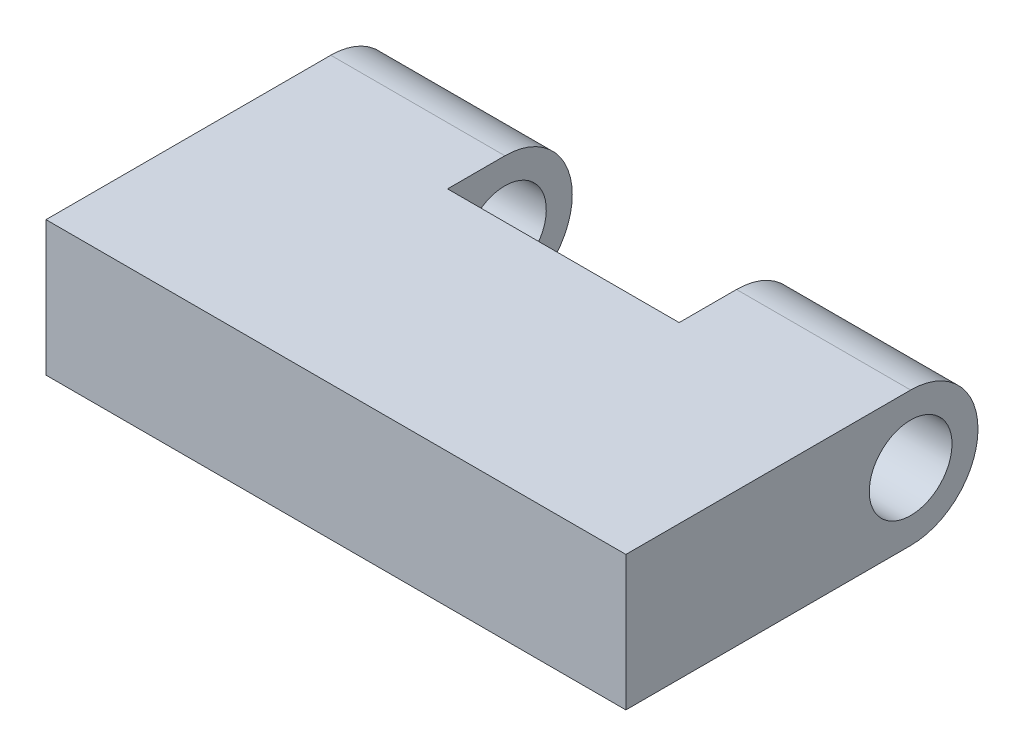
ISO-10303-21;
HEADER;
FILE_DESCRIPTION(('STEP AP214'),'2;1');
FILE_NAME('part.step','',(''),(''),'','','');
FILE_SCHEMA(('AUTOMOTIVE_DESIGN { 1 0 10303 214 1 1 1 1 }'));
ENDSEC;
DATA;
#1=APPLICATION_CONTEXT('core data for automotive mechanical design processes');
#2=APPLICATION_PROTOCOL_DEFINITION('international standard','automotive_design',2000,#1);
#3=PRODUCT_CONTEXT('',#1,'mechanical');
#4=PRODUCT('Part','Part','',(#3));
#5=PRODUCT_RELATED_PRODUCT_CATEGORY('part','',(#4));
#6=PRODUCT_DEFINITION_FORMATION('','',#4);
#7=PRODUCT_DEFINITION_CONTEXT('part definition',#1,'design');
#8=PRODUCT_DEFINITION('design','',#6,#7);
#9=PRODUCT_DEFINITION_SHAPE('','',#8);
#10=(LENGTH_UNIT() NAMED_UNIT(*) SI_UNIT(.MILLI.,.METRE.));
#11=(NAMED_UNIT(*) PLANE_ANGLE_UNIT() SI_UNIT($,.RADIAN.));
#12=(NAMED_UNIT(*) SI_UNIT($,.STERADIAN.) SOLID_ANGLE_UNIT());
#13=UNCERTAINTY_MEASURE_WITH_UNIT(LENGTH_MEASURE(1.E-05),#10,'distance_accuracy_value','');
#14=(GEOMETRIC_REPRESENTATION_CONTEXT(3) GLOBAL_UNCERTAINTY_ASSIGNED_CONTEXT((#13)) GLOBAL_UNIT_ASSIGNED_CONTEXT((#10,
#11,#12)) REPRESENTATION_CONTEXT('',''));
#15=CARTESIAN_POINT('',(0.,0.,0.));
#16=DIRECTION('',(0.,0.,1.));
#17=DIRECTION('',(1.,0.,0.));
#18=AXIS2_PLACEMENT_3D('',#15,#16,#17);
#19=CARTESIAN_POINT('',(6.05974292566278,17.5769670723901,-2.39859921827593));
#20=DIRECTION('',(1.,0.,0.));
#21=DIRECTION('',(0.,1.,0.));
#22=AXIS2_PLACEMENT_3D('',#19,#20,#21);
#23=PLANE('',#22);
#24=CARTESIAN_POINT('',(6.05974292566278,17.5769670723901,-2.39859921827593));
#25=DIRECTION('',(1.,0.,0.));
#26=DIRECTION('',(0.,1.,0.));
#27=AXIS2_PLACEMENT_3D('',#24,#25,#26);
#28=CIRCLE('',#27,2.37553);
#29=CARTESIAN_POINT('',(6.05974292566278,19.9524970723901,-2.39859921827593));
#30=VERTEX_POINT('',#29);
#31=EDGE_CURVE('E151',#30,#30,#28,.T.);
#32=ORIENTED_EDGE('',*,*,#31,.T.);
#33=EDGE_LOOP('',(#32));
#34=FACE_BOUND('',#33,.T.);
#35=DIRECTION('',(0.,-1.,0.));
#36=VECTOR('',#35,1.);
#37=CARTESIAN_POINT('',(6.05974292566278,13.7097679309726,0.894908454199594));
#38=LINE('',#37,#36);
#39=CARTESIAN_POINT('',(6.05974292566278,21.4441662138076,0.894908454199594));
#40=VERTEX_POINT('',#39);
#41=CARTESIAN_POINT('',(6.05974292566278,13.7097679309726,0.894908454199594));
#42=VERTEX_POINT('',#41);
#43=EDGE_CURVE('E50',#40,#42,#38,.T.);
#44=ORIENTED_EDGE('',*,*,#43,.F.);
#45=DIRECTION('',(0.,0.,1.));
#46=VECTOR('',#45,1.);
#47=CARTESIAN_POINT('',(6.05974292566278,21.4441662138076,3.36865125823493));
#48=LINE('',#47,#46);
#49=CARTESIAN_POINT('',(6.05974292566278,21.4441662138076,-2.39859921827593));
#50=VERTEX_POINT('',#49);
#51=EDGE_CURVE('E71',#50,#40,#48,.T.);
#52=ORIENTED_EDGE('',*,*,#51,.F.);
#53=CARTESIAN_POINT('',(6.05974292566278,17.5769670723901,-2.39859921827593));
#54=DIRECTION('',(1.,0.,0.));
#55=DIRECTION('',(0.,1.,0.));
#56=AXIS2_PLACEMENT_3D('',#53,#54,#55);
#57=CIRCLE('',#56,3.86719914141752);
#58=CARTESIAN_POINT('',(6.05974292566278,13.7097679309726,-2.39859921827593));
#59=VERTEX_POINT('',#58);
#60=EDGE_CURVE('E169',#59,#50,#57,.T.);
#61=ORIENTED_EDGE('',*,*,#60,.F.);
#62=DIRECTION('',(0.,0.,-1.));
#63=VECTOR('',#62,1.);
#64=CARTESIAN_POINT('',(6.05974292566278,13.7097679309726,3.36865125823493));
#65=LINE('',#64,#63);
#66=EDGE_CURVE('E159',#42,#59,#65,.T.);
#67=ORIENTED_EDGE('',*,*,#66,.F.);
#68=EDGE_LOOP('',(#44,#52,#61,#67));
#69=FACE_BOUND('',#68,.T.);
#70=ADVANCED_FACE('F35',(#34,#69),#23,.F.);
#71=CARTESIAN_POINT('',(16.0597429256628,17.5769670723901,-2.39859921827593));
#72=DIRECTION('',(1.,0.,0.));
#73=DIRECTION('',(0.,1.,0.));
#74=AXIS2_PLACEMENT_3D('',#71,#72,#73);
#75=PLANE('',#74);
#76=DIRECTION('',(0.,-1.,0.));
#77=VECTOR('',#76,1.);
#78=CARTESIAN_POINT('',(16.0597429256628,21.4441662138076,13.9538431601005));
#79=LINE('',#78,#77);
#80=CARTESIAN_POINT('',(16.0597429256628,21.4441662138076,13.9538431601005));
#81=VERTEX_POINT('',#80);
#82=CARTESIAN_POINT('',(16.0597429256628,13.7097679309726,13.9538431601005));
#83=VERTEX_POINT('',#82);
#84=EDGE_CURVE('E162',#81,#83,#79,.T.);
#85=ORIENTED_EDGE('',*,*,#84,.T.);
#86=DIRECTION('',(0.,0.,-1.));
#87=VECTOR('',#86,1.);
#88=CARTESIAN_POINT('',(16.0597429256628,13.7097679309726,3.36865125823493));
#89=LINE('',#88,#87);
#90=CARTESIAN_POINT('',(16.0597429256628,13.7097679309726,-2.39859921827593));
#91=VERTEX_POINT('',#90);
#92=EDGE_CURVE('E78',#83,#91,#89,.T.);
#93=ORIENTED_EDGE('',*,*,#92,.T.);
#94=CARTESIAN_POINT('',(16.0597429256628,17.5769670723901,-2.39859921827593));
#95=DIRECTION('',(1.,0.,0.));
#96=DIRECTION('',(0.,1.,0.));
#97=AXIS2_PLACEMENT_3D('',#94,#95,#96);
#98=CIRCLE('',#97,3.86719914141752);
#99=CARTESIAN_POINT('',(16.0597429256628,21.4441662138076,-2.39859921827593));
#100=VERTEX_POINT('',#99);
#101=EDGE_CURVE('E165',#91,#100,#98,.T.);
#102=ORIENTED_EDGE('',*,*,#101,.T.);
#103=DIRECTION('',(0.,0.,1.));
#104=VECTOR('',#103,1.);
#105=CARTESIAN_POINT('',(16.0597429256628,21.4441662138076,-2.39859921827593));
#106=LINE('',#105,#104);
#107=EDGE_CURVE('E59',#100,#81,#106,.T.);
#108=ORIENTED_EDGE('',*,*,#107,.T.);
#109=EDGE_LOOP('',(#85,#93,#102,#108));
#110=FACE_BOUND('',#109,.T.);
#111=CARTESIAN_POINT('',(16.0597429256628,17.5769670723901,-2.39859921827593));
#112=DIRECTION('',(1.,0.,0.));
#113=DIRECTION('',(0.,1.,0.));
#114=AXIS2_PLACEMENT_3D('',#111,#112,#113);
#115=CIRCLE('',#114,2.37553);
#116=CARTESIAN_POINT('',(16.0597429256628,19.9524970723901,-2.39859921827593));
#117=VERTEX_POINT('',#116);
#118=EDGE_CURVE('E156',#117,#117,#115,.T.);
#119=ORIENTED_EDGE('',*,*,#118,.F.);
#120=EDGE_LOOP('',(#119));
#121=FACE_BOUND('',#120,.T.);
#122=ADVANCED_FACE('F192',(#110,#121),#75,.T.);
#123=CARTESIAN_POINT('',(16.0597429256628,21.4441662138076,13.9538431601005));
#124=DIRECTION('',(0.,0.,-1.));
#125=DIRECTION('',(0.,1.,0.));
#126=AXIS2_PLACEMENT_3D('',#123,#124,#125);
#127=PLANE('',#126);
#128=DIRECTION('',(-1.,0.,0.));
#129=VECTOR('',#128,1.);
#130=CARTESIAN_POINT('',(16.0597429256628,21.4441662138076,13.9538431601005));
#131=LINE('',#130,#129);
#132=CARTESIAN_POINT('',(-17.2393058740624,21.4441662138076,13.9538431601005));
#133=VERTEX_POINT('',#132);
#134=EDGE_CURVE('E122',#81,#133,#131,.T.);
#135=ORIENTED_EDGE('',*,*,#134,.T.);
#136=DIRECTION('',(0.,-1.,0.));
#137=VECTOR('',#136,1.);
#138=CARTESIAN_POINT('',(-17.2393058740624,21.4441662138076,13.9538431601005));
#139=LINE('',#138,#137);
#140=CARTESIAN_POINT('',(-17.2393058740624,13.7097679309726,13.9538431601005));
#141=VERTEX_POINT('',#140);
#142=EDGE_CURVE('E118',#133,#141,#139,.T.);
#143=ORIENTED_EDGE('',*,*,#142,.T.);
#144=DIRECTION('',(-1.,0.,0.));
#145=VECTOR('',#144,1.);
#146=CARTESIAN_POINT('',(16.0597429256628,13.7097679309726,13.9538431601005));
#147=LINE('',#146,#145);
#148=EDGE_CURVE('E11',#83,#141,#147,.T.);
#149=ORIENTED_EDGE('',*,*,#148,.F.);
#150=ORIENTED_EDGE('',*,*,#84,.F.);
#151=EDGE_LOOP('',(#135,#143,#149,#150));
#152=FACE_BOUND('',#151,.T.);
#153=ADVANCED_FACE('F37',(#152),#127,.F.);
#154=CARTESIAN_POINT('',(16.0597429256628,13.7097679309726,3.36865125823493));
#155=DIRECTION('',(0.,1.,0.));
#156=DIRECTION('',(-1.,0.,0.));
#157=AXIS2_PLACEMENT_3D('',#154,#155,#156);
#158=PLANE('',#157);
#159=ORIENTED_EDGE('',*,*,#148,.T.);
#160=DIRECTION('',(0.,0.,-1.));
#161=VECTOR('',#160,1.);
#162=CARTESIAN_POINT('',(-17.2393058740624,13.7097679309726,3.36865125823493));
#163=LINE('',#162,#161);
#164=CARTESIAN_POINT('',(-17.2393058740624,13.7097679309726,-2.39859921827593));
#165=VERTEX_POINT('',#164);
#166=EDGE_CURVE('E108',#141,#165,#163,.T.);
#167=ORIENTED_EDGE('',*,*,#166,.T.);
#168=DIRECTION('',(1.,0.,0.));
#169=VECTOR('',#168,1.);
#170=CARTESIAN_POINT('',(-17.2393058740624,13.7097679309726,-2.39859921827593));
#171=LINE('',#170,#169);
#172=CARTESIAN_POINT('',(-7.23930587406244,13.7097679309726,-2.39859921827593));
#173=VERTEX_POINT('',#172);
#174=EDGE_CURVE('E143',#165,#173,#171,.T.);
#175=ORIENTED_EDGE('',*,*,#174,.T.);
#176=DIRECTION('',(0.,0.,-1.));
#177=VECTOR('',#176,1.);
#178=CARTESIAN_POINT('',(-7.23930587406244,13.7097679309726,3.36865125823493));
#179=LINE('',#178,#177);
#180=CARTESIAN_POINT('',(-7.23930587406244,13.7097679309726,0.894908454199594));
#181=VERTEX_POINT('',#180);
#182=EDGE_CURVE('E137',#181,#173,#179,.T.);
#183=ORIENTED_EDGE('',*,*,#182,.F.);
#184=DIRECTION('',(1.,0.,0.));
#185=VECTOR('',#184,1.);
#186=CARTESIAN_POINT('',(-22.4168120081579,13.7097679309726,0.894908454199594));
#187=LINE('',#186,#185);
#188=EDGE_CURVE('E147',#181,#42,#187,.T.);
#189=ORIENTED_EDGE('',*,*,#188,.T.);
#190=ORIENTED_EDGE('',*,*,#66,.T.);
#191=DIRECTION('',(-1.,0.,0.));
#192=VECTOR('',#191,1.);
#193=CARTESIAN_POINT('',(16.0597429256628,13.7097679309726,-2.39859921827593));
#194=LINE('',#193,#192);
#195=EDGE_CURVE('E43',#91,#59,#194,.T.);
#196=ORIENTED_EDGE('',*,*,#195,.F.);
#197=ORIENTED_EDGE('',*,*,#92,.F.);
#198=EDGE_LOOP('',(#159,#167,#175,#183,#189,#190,#196,#197));
#199=FACE_BOUND('',#198,.T.);
#200=ADVANCED_FACE('F106',(#199),#158,.F.);
#201=CARTESIAN_POINT('',(16.0597429256628,17.5769670723901,-2.39859921827593));
#202=DIRECTION('',(-1.,0.,0.));
#203=DIRECTION('',(0.,-1.,0.));
#204=AXIS2_PLACEMENT_3D('',#201,#202,#203);
#205=CYLINDRICAL_SURFACE('',#204,3.86719914141752);
#206=ORIENTED_EDGE('',*,*,#60,.T.);
#207=DIRECTION('',(-1.,0.,0.));
#208=VECTOR('',#207,1.);
#209=CARTESIAN_POINT('',(16.0597429256628,21.4441662138076,-2.39859921827593));
#210=LINE('',#209,#208);
#211=EDGE_CURVE('E173',#100,#50,#210,.T.);
#212=ORIENTED_EDGE('',*,*,#211,.F.);
#213=ORIENTED_EDGE('',*,*,#101,.F.);
#214=ORIENTED_EDGE('',*,*,#195,.T.);
#215=EDGE_LOOP('',(#206,#212,#213,#214));
#216=FACE_BOUND('',#215,.T.);
#217=ADVANCED_FACE('F178',(#216),#205,.T.);
#218=CARTESIAN_POINT('',(16.0597429256628,21.4441662138076,3.36865125823493));
#219=DIRECTION('',(0.,-1.,0.));
#220=DIRECTION('',(1.,0.,0.));
#221=AXIS2_PLACEMENT_3D('',#218,#219,#220);
#222=PLANE('',#221);
#223=ORIENTED_EDGE('',*,*,#51,.T.);
#224=DIRECTION('',(1.,0.,0.));
#225=VECTOR('',#224,1.);
#226=CARTESIAN_POINT('',(-22.4168120081579,21.4441662138076,0.894908454199594));
#227=LINE('',#226,#225);
#228=CARTESIAN_POINT('',(-7.23930587406244,21.4441662138076,0.894908454199594));
#229=VERTEX_POINT('',#228);
#230=EDGE_CURVE('E145',#229,#40,#227,.T.);
#231=ORIENTED_EDGE('',*,*,#230,.F.);
#232=DIRECTION('',(0.,0.,1.));
#233=VECTOR('',#232,1.);
#234=CARTESIAN_POINT('',(-7.23930587406244,21.4441662138076,3.36865125823493));
#235=LINE('',#234,#233);
#236=CARTESIAN_POINT('',(-7.23930587406244,21.4441662138076,-2.39859921827593));
#237=VERTEX_POINT('',#236);
#238=EDGE_CURVE('E124',#237,#229,#235,.T.);
#239=ORIENTED_EDGE('',*,*,#238,.F.);
#240=DIRECTION('',(1.,0.,0.));
#241=VECTOR('',#240,1.);
#242=CARTESIAN_POINT('',(-17.2393058740624,21.4441662138076,-2.39859921827593));
#243=LINE('',#242,#241);
#244=CARTESIAN_POINT('',(-17.2393058740624,21.4441662138076,-2.39859921827593));
#245=VERTEX_POINT('',#244);
#246=EDGE_CURVE('E136',#245,#237,#243,.T.);
#247=ORIENTED_EDGE('',*,*,#246,.F.);
#248=DIRECTION('',(0.,0.,1.));
#249=VECTOR('',#248,1.);
#250=CARTESIAN_POINT('',(-17.2393058740624,21.4441662138076,-2.39859921827593));
#251=LINE('',#250,#249);
#252=EDGE_CURVE('E134',#245,#133,#251,.T.);
#253=ORIENTED_EDGE('',*,*,#252,.T.);
#254=ORIENTED_EDGE('',*,*,#134,.F.);
#255=ORIENTED_EDGE('',*,*,#107,.F.);
#256=ORIENTED_EDGE('',*,*,#211,.T.);
#257=EDGE_LOOP('',(#223,#231,#239,#247,#253,#254,#255,#256));
#258=FACE_BOUND('',#257,.T.);
#259=ADVANCED_FACE('F186',(#258),#222,.F.);
#260=CARTESIAN_POINT('',(16.0597429256628,17.5769670723901,-2.39859921827593));
#261=DIRECTION('',(-1.,0.,0.));
#262=DIRECTION('',(0.,-1.,0.));
#263=AXIS2_PLACEMENT_3D('',#260,#261,#262);
#264=CYLINDRICAL_SURFACE('',#263,2.37553);
#265=ORIENTED_EDGE('',*,*,#118,.T.);
#266=EDGE_LOOP('',(#265));
#267=FACE_BOUND('',#266,.T.);
#268=ORIENTED_EDGE('',*,*,#31,.F.);
#269=EDGE_LOOP('',(#268));
#270=FACE_BOUND('',#269,.T.);
#271=ADVANCED_FACE('F198',(#267,#270),#264,.F.);
#272=CARTESIAN_POINT('',(-22.4168120081579,13.7097679309726,0.894908454199594));
#273=DIRECTION('',(0.,0.,1.));
#274=DIRECTION('',(1.,0.,0.));
#275=AXIS2_PLACEMENT_3D('',#272,#273,#274);
#276=PLANE('',#275);
#277=DIRECTION('',(0.,-1.,0.));
#278=VECTOR('',#277,1.);
#279=CARTESIAN_POINT('',(-7.23930587406244,13.7097679309726,0.894908454199594));
#280=LINE('',#279,#278);
#281=EDGE_CURVE('E148',#229,#181,#280,.T.);
#282=ORIENTED_EDGE('',*,*,#281,.F.);
#283=ORIENTED_EDGE('',*,*,#230,.T.);
#284=ORIENTED_EDGE('',*,*,#43,.T.);
#285=ORIENTED_EDGE('',*,*,#188,.F.);
#286=EDGE_LOOP('',(#282,#283,#284,#285));
#287=FACE_BOUND('',#286,.T.);
#288=ADVANCED_FACE('F182',(#287),#276,.F.);
#289=CARTESIAN_POINT('',(-7.23930587406244,17.5769670723901,-2.39859921827593));
#290=DIRECTION('',(-1.,0.,0.));
#291=DIRECTION('',(0.,1.,0.));
#292=AXIS2_PLACEMENT_3D('',#289,#290,#291);
#293=PLANE('',#292);
#294=CARTESIAN_POINT('',(-7.23930587406244,17.5769670723901,-2.39859921827593));
#295=DIRECTION('',(1.,0.,0.));
#296=DIRECTION('',(0.,1.,0.));
#297=AXIS2_PLACEMENT_3D('',#294,#295,#296);
#298=CIRCLE('',#297,2.37553);
#299=CARTESIAN_POINT('',(-7.23930587406244,19.9524970723901,-2.39859921827593));
#300=VERTEX_POINT('',#299);
#301=EDGE_CURVE('E130',#300,#300,#298,.T.);
#302=ORIENTED_EDGE('',*,*,#301,.F.);
#303=EDGE_LOOP('',(#302));
#304=FACE_BOUND('',#303,.T.);
#305=ORIENTED_EDGE('',*,*,#238,.T.);
#306=ORIENTED_EDGE('',*,*,#281,.T.);
#307=ORIENTED_EDGE('',*,*,#182,.T.);
#308=CARTESIAN_POINT('',(-7.23930587406244,17.5769670723901,-2.39859921827593));
#309=DIRECTION('',(1.,0.,0.));
#310=DIRECTION('',(0.,1.,0.));
#311=AXIS2_PLACEMENT_3D('',#308,#309,#310);
#312=CIRCLE('',#311,3.86719914141752);
#313=EDGE_CURVE('E127',#173,#237,#312,.T.);
#314=ORIENTED_EDGE('',*,*,#313,.T.);
#315=EDGE_LOOP('',(#305,#306,#307,#314));
#316=FACE_BOUND('',#315,.T.);
#317=ADVANCED_FACE('F188',(#304,#316),#293,.F.);
#318=CARTESIAN_POINT('',(-17.2393058740624,17.5769670723901,-2.39859921827593));
#319=DIRECTION('',(-1.,0.,0.));
#320=DIRECTION('',(0.,1.,0.));
#321=AXIS2_PLACEMENT_3D('',#318,#319,#320);
#322=PLANE('',#321);
#323=ORIENTED_EDGE('',*,*,#142,.F.);
#324=ORIENTED_EDGE('',*,*,#252,.F.);
#325=CARTESIAN_POINT('',(-17.2393058740624,17.5769670723901,-2.39859921827593));
#326=DIRECTION('',(1.,0.,0.));
#327=DIRECTION('',(0.,1.,0.));
#328=AXIS2_PLACEMENT_3D('',#325,#326,#327);
#329=CIRCLE('',#328,3.86719914141752);
#330=EDGE_CURVE('E120',#165,#245,#329,.T.);
#331=ORIENTED_EDGE('',*,*,#330,.F.);
#332=ORIENTED_EDGE('',*,*,#166,.F.);
#333=EDGE_LOOP('',(#323,#324,#331,#332));
#334=FACE_BOUND('',#333,.T.);
#335=CARTESIAN_POINT('',(-17.2393058740624,17.5769670723901,-2.39859921827593));
#336=DIRECTION('',(1.,0.,0.));
#337=DIRECTION('',(0.,1.,0.));
#338=AXIS2_PLACEMENT_3D('',#335,#336,#337);
#339=CIRCLE('',#338,2.37553);
#340=CARTESIAN_POINT('',(-17.2393058740624,19.9524970723901,-2.39859921827593));
#341=VERTEX_POINT('',#340);
#342=EDGE_CURVE('E139',#341,#341,#339,.T.);
#343=ORIENTED_EDGE('',*,*,#342,.T.);
#344=EDGE_LOOP('',(#343));
#345=FACE_BOUND('',#344,.T.);
#346=ADVANCED_FACE('F115',(#334,#345),#322,.T.);
#347=CARTESIAN_POINT('',(-17.2393058740624,17.5769670723901,-2.39859921827593));
#348=DIRECTION('',(1.,0.,0.));
#349=DIRECTION('',(0.,-1.,0.));
#350=AXIS2_PLACEMENT_3D('',#347,#348,#349);
#351=CYLINDRICAL_SURFACE('',#350,3.86719914141752);
#352=ORIENTED_EDGE('',*,*,#313,.F.);
#353=ORIENTED_EDGE('',*,*,#174,.F.);
#354=ORIENTED_EDGE('',*,*,#330,.T.);
#355=ORIENTED_EDGE('',*,*,#246,.T.);
#356=EDGE_LOOP('',(#352,#353,#354,#355));
#357=FACE_BOUND('',#356,.T.);
#358=ADVANCED_FACE('F191',(#357),#351,.T.);
#359=CARTESIAN_POINT('',(-17.2393058740624,17.5769670723901,-2.39859921827593));
#360=DIRECTION('',(1.,0.,0.));
#361=DIRECTION('',(0.,-1.,0.));
#362=AXIS2_PLACEMENT_3D('',#359,#360,#361);
#363=CYLINDRICAL_SURFACE('',#362,2.37553);
#364=ORIENTED_EDGE('',*,*,#342,.F.);
#365=EDGE_LOOP('',(#364));
#366=FACE_BOUND('',#365,.T.);
#367=ORIENTED_EDGE('',*,*,#301,.T.);
#368=EDGE_LOOP('',(#367));
#369=FACE_BOUND('',#368,.T.);
#370=ADVANCED_FACE('F269',(#366,#369),#363,.F.);
#371=CLOSED_SHELL('',(#70,#122,#153,#200,#217,#259,#271,#288,#317,#346,#358,#370));
#372=MANIFOLD_SOLID_BREP('B2',#371);
#373=ADVANCED_BREP_SHAPE_REPRESENTATION('',(#18,#372),#14);
#374=SHAPE_DEFINITION_REPRESENTATION(#9,#373);
ENDSEC;
END-ISO-10303-21;
